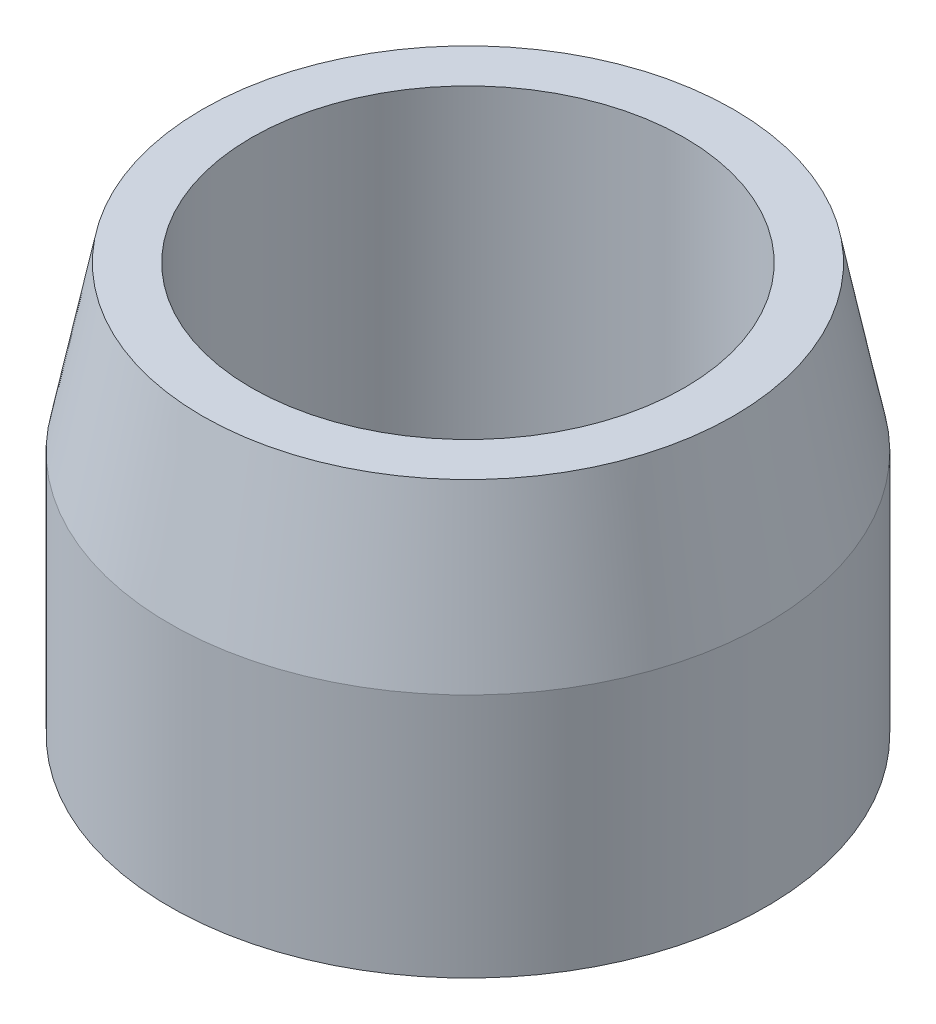
ISO-10303-21;
HEADER;
FILE_DESCRIPTION(('STEP AP214'),'2;1');
FILE_NAME('part.step','',(''),(''),'','','');
FILE_SCHEMA(('AUTOMOTIVE_DESIGN { 1 0 10303 214 1 1 1 1 }'));
ENDSEC;
DATA;
#1=APPLICATION_CONTEXT('core data for automotive mechanical design processes');
#2=APPLICATION_PROTOCOL_DEFINITION('international standard','automotive_design',2000,#1);
#3=PRODUCT_CONTEXT('',#1,'mechanical');
#4=PRODUCT('Part','Part','',(#3));
#5=PRODUCT_RELATED_PRODUCT_CATEGORY('part','',(#4));
#6=PRODUCT_DEFINITION_FORMATION('','',#4);
#7=PRODUCT_DEFINITION_CONTEXT('part definition',#1,'design');
#8=PRODUCT_DEFINITION('design','',#6,#7);
#9=PRODUCT_DEFINITION_SHAPE('','',#8);
#10=(LENGTH_UNIT() NAMED_UNIT(*) SI_UNIT(.MILLI.,.METRE.));
#11=(NAMED_UNIT(*) PLANE_ANGLE_UNIT() SI_UNIT($,.RADIAN.));
#12=(NAMED_UNIT(*) SI_UNIT($,.STERADIAN.) SOLID_ANGLE_UNIT());
#13=UNCERTAINTY_MEASURE_WITH_UNIT(LENGTH_MEASURE(1.E-05),#10,'distance_accuracy_value','');
#14=(GEOMETRIC_REPRESENTATION_CONTEXT(3) GLOBAL_UNCERTAINTY_ASSIGNED_CONTEXT((#13)) GLOBAL_UNIT_ASSIGNED_CONTEXT((#10,
#11,#12)) REPRESENTATION_CONTEXT('',''));
#15=CARTESIAN_POINT('',(0.,0.,0.));
#16=DIRECTION('',(0.,0.,1.));
#17=DIRECTION('',(1.,0.,0.));
#18=AXIS2_PLACEMENT_3D('',#15,#16,#17);
#19=CARTESIAN_POINT('',(0.,0.,0.));
#20=DIRECTION('',(0.,-1.,0.));
#21=DIRECTION('',(0.,0.,-1.));
#22=AXIS2_PLACEMENT_3D('',#19,#20,#21);
#23=CYLINDRICAL_SURFACE('',#22,3.65);
#24=CARTESIAN_POINT('',(0.,3.,0.));
#25=DIRECTION('',(0.,-1.,0.));
#26=DIRECTION('',(0.,0.,-1.));
#27=AXIS2_PLACEMENT_3D('',#24,#25,#26);
#28=CIRCLE('',#27,3.65);
#29=CARTESIAN_POINT('',(0.,3.,-3.65));
#30=VERTEX_POINT('',#29);
#31=EDGE_CURVE('E64',#30,#30,#28,.T.);
#32=ORIENTED_EDGE('',*,*,#31,.T.);
#33=EDGE_LOOP('',(#32));
#34=FACE_BOUND('',#33,.T.);
#35=CARTESIAN_POINT('',(0.,0.,0.));
#36=DIRECTION('',(0.,-1.,0.));
#37=DIRECTION('',(0.,0.,-1.));
#38=AXIS2_PLACEMENT_3D('',#35,#36,#37);
#39=CIRCLE('',#38,3.65);
#40=CARTESIAN_POINT('',(0.,0.,-3.65));
#41=VERTEX_POINT('',#40);
#42=EDGE_CURVE('E10',#41,#41,#39,.T.);
#43=ORIENTED_EDGE('',*,*,#42,.F.);
#44=EDGE_LOOP('',(#43));
#45=FACE_BOUND('',#44,.T.);
#46=ADVANCED_FACE('F41',(#34,#45),#23,.T.);
#47=CARTESIAN_POINT('',(2.65,0.,0.));
#48=DIRECTION('',(0.,-1.,0.));
#49=DIRECTION('',(0.,0.,-1.));
#50=AXIS2_PLACEMENT_3D('',#47,#48,#49);
#51=PLANE('',#50);
#52=ORIENTED_EDGE('',*,*,#42,.T.);
#53=EDGE_LOOP('',(#52));
#54=FACE_BOUND('',#53,.T.);
#55=CARTESIAN_POINT('',(0.,0.,0.));
#56=DIRECTION('',(0.,-1.,0.));
#57=DIRECTION('',(0.,0.,-1.));
#58=AXIS2_PLACEMENT_3D('',#55,#56,#57);
#59=CIRCLE('',#58,2.65);
#60=CARTESIAN_POINT('',(0.,0.,-2.65));
#61=VERTEX_POINT('',#60);
#62=EDGE_CURVE('E48',#61,#61,#59,.T.);
#63=ORIENTED_EDGE('',*,*,#62,.F.);
#64=EDGE_LOOP('',(#63));
#65=FACE_BOUND('',#64,.T.);
#66=ADVANCED_FACE('F83',(#54,#65),#51,.T.);
#67=CARTESIAN_POINT('',(0.,0.,0.));
#68=DIRECTION('',(0.,-1.,0.));
#69=DIRECTION('',(0.,0.,-1.));
#70=AXIS2_PLACEMENT_3D('',#67,#68,#69);
#71=CYLINDRICAL_SURFACE('',#70,2.65);
#72=ORIENTED_EDGE('',*,*,#62,.T.);
#73=EDGE_LOOP('',(#72));
#74=FACE_BOUND('',#73,.T.);
#75=CARTESIAN_POINT('',(0.,5.,0.));
#76=DIRECTION('',(0.,-1.,0.));
#77=DIRECTION('',(0.,0.,-1.));
#78=AXIS2_PLACEMENT_3D('',#75,#76,#77);
#79=CIRCLE('',#78,2.65);
#80=CARTESIAN_POINT('',(0.,5.,-2.65));
#81=VERTEX_POINT('',#80);
#82=EDGE_CURVE('E53',#81,#81,#79,.T.);
#83=ORIENTED_EDGE('',*,*,#82,.F.);
#84=EDGE_LOOP('',(#83));
#85=FACE_BOUND('',#84,.T.);
#86=ADVANCED_FACE('F79',(#74,#85),#71,.F.);
#87=CARTESIAN_POINT('',(2.65,5.,0.));
#88=DIRECTION('',(0.,1.,0.));
#89=DIRECTION('',(0.,0.,1.));
#90=AXIS2_PLACEMENT_3D('',#87,#88,#89);
#91=PLANE('',#90);
#92=ORIENTED_EDGE('',*,*,#82,.T.);
#93=EDGE_LOOP('',(#92));
#94=FACE_BOUND('',#93,.T.);
#95=CARTESIAN_POINT('',(0.,5.,0.));
#96=DIRECTION('',(0.,-1.,0.));
#97=DIRECTION('',(0.,0.,-1.));
#98=AXIS2_PLACEMENT_3D('',#95,#96,#97);
#99=CIRCLE('',#98,3.25);
#100=CARTESIAN_POINT('',(0.,5.,-3.25));
#101=VERTEX_POINT('',#100);
#102=EDGE_CURVE('E58',#101,#101,#99,.T.);
#103=ORIENTED_EDGE('',*,*,#102,.F.);
#104=EDGE_LOOP('',(#103));
#105=FACE_BOUND('',#104,.T.);
#106=ADVANCED_FACE('F73',(#94,#105),#91,.T.);
#107=CARTESIAN_POINT('',(0.,3.,0.));
#108=DIRECTION('',(0.,-1.,0.));
#109=DIRECTION('',(0.,0.,-1.));
#110=AXIS2_PLACEMENT_3D('',#107,#108,#109);
#111=CONICAL_SURFACE('',#110,3.65,0.197395559849881);
#112=ORIENTED_EDGE('',*,*,#102,.T.);
#113=EDGE_LOOP('',(#112));
#114=FACE_BOUND('',#113,.T.);
#115=ORIENTED_EDGE('',*,*,#31,.F.);
#116=EDGE_LOOP('',(#115));
#117=FACE_BOUND('',#116,.T.);
#118=ADVANCED_FACE('F71',(#114,#117),#111,.T.);
#119=CLOSED_SHELL('',(#46,#66,#86,#106,#118));
#120=MANIFOLD_SOLID_BREP('B2',#119);
#121=ADVANCED_BREP_SHAPE_REPRESENTATION('',(#18,#120),#14);
#122=SHAPE_DEFINITION_REPRESENTATION(#9,#121);
ENDSEC;
END-ISO-10303-21;
